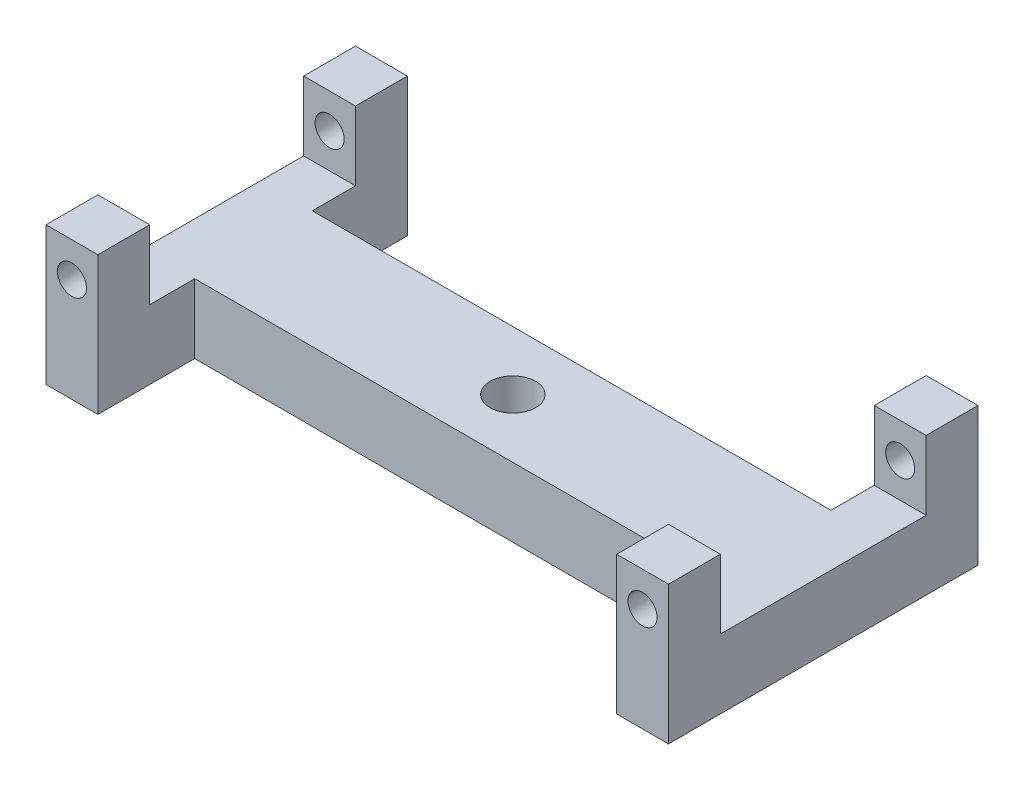
ISO-10303-21;
HEADER;
FILE_DESCRIPTION(('STEP AP214'),'2;1');
FILE_NAME('part.step','',(''),(''),'','','');
FILE_SCHEMA(('AUTOMOTIVE_DESIGN { 1 0 10303 214 1 1 1 1 }'));
ENDSEC;
DATA;
#1=APPLICATION_CONTEXT('core data for automotive mechanical design processes');
#2=APPLICATION_PROTOCOL_DEFINITION('international standard','automotive_design',2000,#1);
#3=PRODUCT_CONTEXT('',#1,'mechanical');
#4=PRODUCT('Part','Part','',(#3));
#5=PRODUCT_RELATED_PRODUCT_CATEGORY('part','',(#4));
#6=PRODUCT_DEFINITION_FORMATION('','',#4);
#7=PRODUCT_DEFINITION_CONTEXT('part definition',#1,'design');
#8=PRODUCT_DEFINITION('design','',#6,#7);
#9=PRODUCT_DEFINITION_SHAPE('','',#8);
#10=(LENGTH_UNIT() NAMED_UNIT(*) SI_UNIT(.MILLI.,.METRE.));
#11=(NAMED_UNIT(*) PLANE_ANGLE_UNIT() SI_UNIT($,.RADIAN.));
#12=(NAMED_UNIT(*) SI_UNIT($,.STERADIAN.) SOLID_ANGLE_UNIT());
#13=UNCERTAINTY_MEASURE_WITH_UNIT(LENGTH_MEASURE(1.E-05),#10,'distance_accuracy_value','');
#14=(GEOMETRIC_REPRESENTATION_CONTEXT(3) GLOBAL_UNCERTAINTY_ASSIGNED_CONTEXT((#13)) GLOBAL_UNIT_ASSIGNED_CONTEXT((#10,
#11,#12)) REPRESENTATION_CONTEXT('',''));
#15=CARTESIAN_POINT('',(0.,0.,0.));
#16=DIRECTION('',(0.,0.,1.));
#17=DIRECTION('',(1.,0.,0.));
#18=AXIS2_PLACEMENT_3D('',#15,#16,#17);
#19=CARTESIAN_POINT('',(0.,6.35,0.));
#20=DIRECTION('',(0.,-1.,0.));
#21=DIRECTION('',(0.,0.,-1.));
#22=AXIS2_PLACEMENT_3D('',#19,#20,#21);
#23=CYLINDRICAL_SURFACE('',#22,4.191);
#24=CARTESIAN_POINT('',(0.,6.35,0.));
#25=DIRECTION('',(0.,1.,0.));
#26=DIRECTION('',(0.,0.,1.));
#27=AXIS2_PLACEMENT_3D('',#24,#25,#26);
#28=CIRCLE('',#27,4.191);
#29=CARTESIAN_POINT('',(0.,6.35,4.191));
#30=VERTEX_POINT('',#29);
#31=EDGE_CURVE('E362',#30,#30,#28,.T.);
#32=ORIENTED_EDGE('',*,*,#31,.T.);
#33=EDGE_LOOP('',(#32));
#34=FACE_BOUND('',#33,.T.);
#35=CARTESIAN_POINT('',(0.,0.38125,0.));
#36=DIRECTION('',(0.,-1.,0.));
#37=DIRECTION('',(0.,0.,-1.));
#38=AXIS2_PLACEMENT_3D('',#35,#36,#37);
#39=CIRCLE('',#38,4.191);
#40=CARTESIAN_POINT('',(0.,0.38125,-4.191));
#41=VERTEX_POINT('',#40);
#42=EDGE_CURVE('E48',#41,#41,#39,.T.);
#43=ORIENTED_EDGE('',*,*,#42,.T.);
#44=EDGE_LOOP('',(#43));
#45=FACE_BOUND('',#44,.T.);
#46=ADVANCED_FACE('F44',(#34,#45),#23,.F.);
#47=CARTESIAN_POINT('',(0.,6.35,0.));
#48=DIRECTION('',(0.,1.,0.));
#49=DIRECTION('',(0.,0.,1.));
#50=AXIS2_PLACEMENT_3D('',#47,#48,#49);
#51=PLANE('',#50);
#52=ORIENTED_EDGE('',*,*,#31,.F.);
#53=EDGE_LOOP('',(#52));
#54=FACE_BOUND('',#53,.T.);
#55=DIRECTION('',(0.,0.,-1.));
#56=VECTOR('',#55,1.);
#57=CARTESIAN_POINT('',(47.625,6.35,28.575));
#58=LINE('',#57,#56);
#59=CARTESIAN_POINT('',(47.625,6.35,19.05));
#60=VERTEX_POINT('',#59);
#61=CARTESIAN_POINT('',(47.625,6.35,10.795));
#62=VERTEX_POINT('',#61);
#63=EDGE_CURVE('E338',#60,#62,#58,.T.);
#64=ORIENTED_EDGE('',*,*,#63,.F.);
#65=DIRECTION('',(-1.,0.,0.));
#66=VECTOR('',#65,1.);
#67=CARTESIAN_POINT('',(57.15,6.35,19.05));
#68=LINE('',#67,#66);
#69=CARTESIAN_POINT('',(57.15,6.35,19.05));
#70=VERTEX_POINT('',#69);
#71=EDGE_CURVE('E265',#70,#60,#68,.T.);
#72=ORIENTED_EDGE('',*,*,#71,.F.);
#73=DIRECTION('',(0.,0.,-1.));
#74=VECTOR('',#73,1.);
#75=CARTESIAN_POINT('',(57.15,6.35,-10.795));
#76=LINE('',#75,#74);
#77=CARTESIAN_POINT('',(57.15,6.35,-18.7325));
#78=VERTEX_POINT('',#77);
#79=EDGE_CURVE('E365',#70,#78,#76,.T.);
#80=ORIENTED_EDGE('',*,*,#79,.T.);
#81=DIRECTION('',(1.,0.,0.));
#82=VECTOR('',#81,1.);
#83=CARTESIAN_POINT('',(47.625,6.35,-18.7325));
#84=LINE('',#83,#82);
#85=CARTESIAN_POINT('',(47.625,6.35,-18.7325));
#86=VERTEX_POINT('',#85);
#87=EDGE_CURVE('E283',#86,#78,#84,.T.);
#88=ORIENTED_EDGE('',*,*,#87,.F.);
#89=DIRECTION('',(0.,0.,1.));
#90=VECTOR('',#89,1.);
#91=CARTESIAN_POINT('',(47.625,6.35,-28.2575));
#92=LINE('',#91,#90);
#93=CARTESIAN_POINT('',(47.625,6.35,-10.795));
#94=VERTEX_POINT('',#93);
#95=EDGE_CURVE('E68',#86,#94,#92,.T.);
#96=ORIENTED_EDGE('',*,*,#95,.T.);
#97=DIRECTION('',(-1.,0.,0.));
#98=VECTOR('',#97,1.);
#99=CARTESIAN_POINT('',(-57.15,6.35,-10.795));
#100=LINE('',#99,#98);
#101=CARTESIAN_POINT('',(-47.625,6.35,-10.795));
#102=VERTEX_POINT('',#101);
#103=EDGE_CURVE('E367',#94,#102,#100,.T.);
#104=ORIENTED_EDGE('',*,*,#103,.T.);
#105=DIRECTION('',(0.,0.,1.));
#106=VECTOR('',#105,1.);
#107=CARTESIAN_POINT('',(-47.625,6.35,-28.2575));
#108=LINE('',#107,#106);
#109=CARTESIAN_POINT('',(-47.625,6.35,-18.7325));
#110=VERTEX_POINT('',#109);
#111=EDGE_CURVE('E355',#110,#102,#108,.T.);
#112=ORIENTED_EDGE('',*,*,#111,.F.);
#113=DIRECTION('',(1.,0.,0.));
#114=VECTOR('',#113,1.);
#115=CARTESIAN_POINT('',(-57.15,6.35,-18.7325));
#116=LINE('',#115,#114);
#117=CARTESIAN_POINT('',(-57.15,6.35,-18.7325));
#118=VERTEX_POINT('',#117);
#119=EDGE_CURVE('E61',#118,#110,#116,.T.);
#120=ORIENTED_EDGE('',*,*,#119,.F.);
#121=DIRECTION('',(0.,0.,1.));
#122=VECTOR('',#121,1.);
#123=CARTESIAN_POINT('',(-57.15,6.35,-10.795));
#124=LINE('',#123,#122);
#125=CARTESIAN_POINT('',(-57.15,6.35,19.05));
#126=VERTEX_POINT('',#125);
#127=EDGE_CURVE('E53',#118,#126,#124,.T.);
#128=ORIENTED_EDGE('',*,*,#127,.T.);
#129=DIRECTION('',(-1.,0.,0.));
#130=VECTOR('',#129,1.);
#131=CARTESIAN_POINT('',(-57.15,6.35,19.05));
#132=LINE('',#131,#130);
#133=CARTESIAN_POINT('',(-47.625,6.35,19.05));
#134=VERTEX_POINT('',#133);
#135=EDGE_CURVE('E299',#134,#126,#132,.T.);
#136=ORIENTED_EDGE('',*,*,#135,.F.);
#137=DIRECTION('',(0.,0.,-1.));
#138=VECTOR('',#137,1.);
#139=CARTESIAN_POINT('',(-47.625,6.35,28.575));
#140=LINE('',#139,#138);
#141=CARTESIAN_POINT('',(-47.625,6.35,10.795));
#142=VERTEX_POINT('',#141);
#143=EDGE_CURVE('E346',#134,#142,#140,.T.);
#144=ORIENTED_EDGE('',*,*,#143,.T.);
#145=DIRECTION('',(1.,0.,0.));
#146=VECTOR('',#145,1.);
#147=CARTESIAN_POINT('',(-57.15,6.35,10.795));
#148=LINE('',#147,#146);
#149=EDGE_CURVE('E12',#142,#62,#148,.T.);
#150=ORIENTED_EDGE('',*,*,#149,.T.);
#151=EDGE_LOOP('',(#64,#72,#80,#88,#96,#104,#112,#120,#128,#136,#144,#150));
#152=FACE_BOUND('',#151,.T.);
#153=ADVANCED_FACE('F392',(#54,#152),#51,.T.);
#154=CARTESIAN_POINT('',(-57.15,6.35,10.795));
#155=DIRECTION('',(0.,0.,-1.));
#156=DIRECTION('',(-1.,0.,0.));
#157=AXIS2_PLACEMENT_3D('',#154,#155,#156);
#158=PLANE('',#157);
#159=DIRECTION('',(0.,-1.,0.));
#160=VECTOR('',#159,1.);
#161=CARTESIAN_POINT('',(47.625,6.35,10.795));
#162=LINE('',#161,#160);
#163=CARTESIAN_POINT('',(47.625,-6.35,10.795));
#164=VERTEX_POINT('',#163);
#165=EDGE_CURVE('E334',#62,#164,#162,.T.);
#166=ORIENTED_EDGE('',*,*,#165,.F.);
#167=ORIENTED_EDGE('',*,*,#149,.F.);
#168=DIRECTION('',(0.,1.,0.));
#169=VECTOR('',#168,1.);
#170=CARTESIAN_POINT('',(-47.625,6.35,10.795));
#171=LINE('',#170,#169);
#172=CARTESIAN_POINT('',(-47.625,-6.35,10.795));
#173=VERTEX_POINT('',#172);
#174=EDGE_CURVE('E341',#173,#142,#171,.T.);
#175=ORIENTED_EDGE('',*,*,#174,.F.);
#176=DIRECTION('',(-1.,0.,0.));
#177=VECTOR('',#176,1.);
#178=CARTESIAN_POINT('',(47.625,-6.35,10.795));
#179=LINE('',#178,#177);
#180=EDGE_CURVE('E223',#164,#173,#179,.T.);
#181=ORIENTED_EDGE('',*,*,#180,.F.);
#182=EDGE_LOOP('',(#166,#167,#175,#181));
#183=FACE_BOUND('',#182,.T.);
#184=ADVANCED_FACE('F395',(#183),#158,.F.);
#185=CARTESIAN_POINT('',(-57.15,6.35,-10.795));
#186=DIRECTION('',(0.,0.,1.));
#187=DIRECTION('',(1.,0.,0.));
#188=AXIS2_PLACEMENT_3D('',#185,#186,#187);
#189=PLANE('',#188);
#190=DIRECTION('',(0.,-1.,0.));
#191=VECTOR('',#190,1.);
#192=CARTESIAN_POINT('',(-47.625,6.35,-10.795));
#193=LINE('',#192,#191);
#194=CARTESIAN_POINT('',(-47.625,-6.35,-10.795));
#195=VERTEX_POINT('',#194);
#196=EDGE_CURVE('E349',#102,#195,#193,.T.);
#197=ORIENTED_EDGE('',*,*,#196,.F.);
#198=ORIENTED_EDGE('',*,*,#103,.F.);
#199=DIRECTION('',(0.,1.,0.));
#200=VECTOR('',#199,1.);
#201=CARTESIAN_POINT('',(47.625,6.35,-10.795));
#202=LINE('',#201,#200);
#203=CARTESIAN_POINT('',(47.625,-6.35,-10.795));
#204=VERTEX_POINT('',#203);
#205=EDGE_CURVE('E196',#204,#94,#202,.T.);
#206=ORIENTED_EDGE('',*,*,#205,.F.);
#207=DIRECTION('',(1.,0.,0.));
#208=VECTOR('',#207,1.);
#209=CARTESIAN_POINT('',(-47.625,-6.35,-10.795));
#210=LINE('',#209,#208);
#211=EDGE_CURVE('E241',#195,#204,#210,.T.);
#212=ORIENTED_EDGE('',*,*,#211,.F.);
#213=EDGE_LOOP('',(#197,#198,#206,#212));
#214=FACE_BOUND('',#213,.T.);
#215=ADVANCED_FACE('F402',(#214),#189,.F.);
#216=CARTESIAN_POINT('',(57.15,6.35,-10.795));
#217=DIRECTION('',(-1.,0.,0.));
#218=DIRECTION('',(0.,0.,1.));
#219=AXIS2_PLACEMENT_3D('',#216,#217,#218);
#220=PLANE('',#219);
#221=DIRECTION('',(0.,1.,0.));
#222=VECTOR('',#221,1.);
#223=CARTESIAN_POINT('',(57.15,6.35,28.575));
#224=LINE('',#223,#222);
#225=CARTESIAN_POINT('',(57.15,-6.35,28.575));
#226=VERTEX_POINT('',#225);
#227=CARTESIAN_POINT('',(57.15,19.05,28.575));
#228=VERTEX_POINT('',#227);
#229=EDGE_CURVE('E201',#226,#228,#224,.T.);
#230=ORIENTED_EDGE('',*,*,#229,.F.);
#231=DIRECTION('',(0.,0.,1.));
#232=VECTOR('',#231,1.);
#233=CARTESIAN_POINT('',(57.15,-6.35,-28.2575));
#234=LINE('',#233,#232);
#235=CARTESIAN_POINT('',(57.15,-6.35,-28.2575));
#236=VERTEX_POINT('',#235);
#237=EDGE_CURVE('E199',#236,#226,#234,.T.);
#238=ORIENTED_EDGE('',*,*,#237,.F.);
#239=DIRECTION('',(0.,-1.,0.));
#240=VECTOR('',#239,1.);
#241=CARTESIAN_POINT('',(57.15,6.35,-28.2575));
#242=LINE('',#241,#240);
#243=CARTESIAN_POINT('',(57.15,19.05,-28.2575));
#244=VERTEX_POINT('',#243);
#245=EDGE_CURVE('E185',#244,#236,#242,.T.);
#246=ORIENTED_EDGE('',*,*,#245,.F.);
#247=DIRECTION('',(0.,0.,-1.));
#248=VECTOR('',#247,1.);
#249=CARTESIAN_POINT('',(57.15,19.05,-28.2575));
#250=LINE('',#249,#248);
#251=CARTESIAN_POINT('',(57.15,19.05,-18.7325));
#252=VERTEX_POINT('',#251);
#253=EDGE_CURVE('E289',#252,#244,#250,.T.);
#254=ORIENTED_EDGE('',*,*,#253,.F.);
#255=DIRECTION('',(0.,-1.,0.));
#256=VECTOR('',#255,1.);
#257=CARTESIAN_POINT('',(57.15,19.05,-18.7325));
#258=LINE('',#257,#256);
#259=EDGE_CURVE('E292',#252,#78,#258,.T.);
#260=ORIENTED_EDGE('',*,*,#259,.T.);
#261=ORIENTED_EDGE('',*,*,#79,.F.);
#262=DIRECTION('',(0.,-1.,0.));
#263=VECTOR('',#262,1.);
#264=CARTESIAN_POINT('',(57.15,19.05,19.05));
#265=LINE('',#264,#263);
#266=CARTESIAN_POINT('',(57.15,19.05,19.05));
#267=VERTEX_POINT('',#266);
#268=EDGE_CURVE('E281',#267,#70,#265,.T.);
#269=ORIENTED_EDGE('',*,*,#268,.F.);
#270=DIRECTION('',(0.,0.,-1.));
#271=VECTOR('',#270,1.);
#272=CARTESIAN_POINT('',(57.15,19.05,28.575));
#273=LINE('',#272,#271);
#274=EDGE_CURVE('E266',#228,#267,#273,.T.);
#275=ORIENTED_EDGE('',*,*,#274,.F.);
#276=EDGE_LOOP('',(#230,#238,#246,#254,#260,#261,#269,#275));
#277=FACE_BOUND('',#276,.T.);
#278=ADVANCED_FACE('F46',(#277),#220,.F.);
#279=CARTESIAN_POINT('',(-57.15,6.35,-10.795));
#280=DIRECTION('',(1.,0.,0.));
#281=DIRECTION('',(0.,0.,-1.));
#282=AXIS2_PLACEMENT_3D('',#279,#280,#281);
#283=PLANE('',#282);
#284=DIRECTION('',(0.,1.,0.));
#285=VECTOR('',#284,1.);
#286=CARTESIAN_POINT('',(-57.15,6.35,-28.2575));
#287=LINE('',#286,#285);
#288=CARTESIAN_POINT('',(-57.15,-6.35,-28.2575));
#289=VERTEX_POINT('',#288);
#290=CARTESIAN_POINT('',(-57.15,19.05,-28.2575));
#291=VERTEX_POINT('',#290);
#292=EDGE_CURVE('E350',#289,#291,#287,.T.);
#293=ORIENTED_EDGE('',*,*,#292,.F.);
#294=DIRECTION('',(0.,0.,-1.));
#295=VECTOR('',#294,1.);
#296=CARTESIAN_POINT('',(-57.15,-6.35,28.575));
#297=LINE('',#296,#295);
#298=CARTESIAN_POINT('',(-57.15,-6.35,28.575));
#299=VERTEX_POINT('',#298);
#300=EDGE_CURVE('E232',#299,#289,#297,.T.);
#301=ORIENTED_EDGE('',*,*,#300,.F.);
#302=DIRECTION('',(0.,-1.,0.));
#303=VECTOR('',#302,1.);
#304=CARTESIAN_POINT('',(-57.15,6.35,28.575));
#305=LINE('',#304,#303);
#306=CARTESIAN_POINT('',(-57.15,19.05,28.575));
#307=VERTEX_POINT('',#306);
#308=EDGE_CURVE('E342',#307,#299,#305,.T.);
#309=ORIENTED_EDGE('',*,*,#308,.F.);
#310=DIRECTION('',(0.,0.,1.));
#311=VECTOR('',#310,1.);
#312=CARTESIAN_POINT('',(-57.15,19.05,28.575));
#313=LINE('',#312,#311);
#314=CARTESIAN_POINT('',(-57.15,19.05,19.05));
#315=VERTEX_POINT('',#314);
#316=EDGE_CURVE('E300',#315,#307,#313,.T.);
#317=ORIENTED_EDGE('',*,*,#316,.F.);
#318=DIRECTION('',(0.,-1.,0.));
#319=VECTOR('',#318,1.);
#320=CARTESIAN_POINT('',(-57.15,19.05,19.05));
#321=LINE('',#320,#319);
#322=EDGE_CURVE('E310',#315,#126,#321,.T.);
#323=ORIENTED_EDGE('',*,*,#322,.T.);
#324=ORIENTED_EDGE('',*,*,#127,.F.);
#325=DIRECTION('',(0.,-1.,0.));
#326=VECTOR('',#325,1.);
#327=CARTESIAN_POINT('',(-57.15,19.05,-18.7325));
#328=LINE('',#327,#326);
#329=CARTESIAN_POINT('',(-57.15,19.05,-18.7325));
#330=VERTEX_POINT('',#329);
#331=EDGE_CURVE('E331',#330,#118,#328,.T.);
#332=ORIENTED_EDGE('',*,*,#331,.F.);
#333=DIRECTION('',(0.,0.,1.));
#334=VECTOR('',#333,1.);
#335=CARTESIAN_POINT('',(-57.15,19.05,-28.2575));
#336=LINE('',#335,#334);
#337=EDGE_CURVE('E316',#291,#330,#336,.T.);
#338=ORIENTED_EDGE('',*,*,#337,.F.);
#339=EDGE_LOOP('',(#293,#301,#309,#317,#323,#324,#332,#338));
#340=FACE_BOUND('',#339,.T.);
#341=ADVANCED_FACE('F389',(#340),#283,.F.);
#342=CARTESIAN_POINT('',(47.625,6.35,-28.2575));
#343=DIRECTION('',(1.,0.,0.));
#344=DIRECTION('',(0.,1.,0.));
#345=AXIS2_PLACEMENT_3D('',#342,#343,#344);
#346=PLANE('',#345);
#347=ORIENTED_EDGE('',*,*,#205,.T.);
#348=ORIENTED_EDGE('',*,*,#95,.F.);
#349=DIRECTION('',(0.,-1.,0.));
#350=VECTOR('',#349,1.);
#351=CARTESIAN_POINT('',(47.625,19.05,-18.7325));
#352=LINE('',#351,#350);
#353=CARTESIAN_POINT('',(47.625,19.05,-18.7325));
#354=VERTEX_POINT('',#353);
#355=EDGE_CURVE('E297',#354,#86,#352,.T.);
#356=ORIENTED_EDGE('',*,*,#355,.F.);
#357=DIRECTION('',(0.,0.,1.));
#358=VECTOR('',#357,1.);
#359=CARTESIAN_POINT('',(47.625,19.05,-28.2575));
#360=LINE('',#359,#358);
#361=CARTESIAN_POINT('',(47.625,19.05,-28.2575));
#362=VERTEX_POINT('',#361);
#363=EDGE_CURVE('E284',#362,#354,#360,.T.);
#364=ORIENTED_EDGE('',*,*,#363,.F.);
#365=DIRECTION('',(0.,1.,0.));
#366=VECTOR('',#365,1.);
#367=CARTESIAN_POINT('',(47.625,6.35,-28.2575));
#368=LINE('',#367,#366);
#369=CARTESIAN_POINT('',(47.625,-6.35,-28.2575));
#370=VERTEX_POINT('',#369);
#371=EDGE_CURVE('E195',#370,#362,#368,.T.);
#372=ORIENTED_EDGE('',*,*,#371,.F.);
#373=DIRECTION('',(0.,0.,-1.));
#374=VECTOR('',#373,1.);
#375=CARTESIAN_POINT('',(47.625,-6.35,-10.795));
#376=LINE('',#375,#374);
#377=EDGE_CURVE('E211',#204,#370,#376,.T.);
#378=ORIENTED_EDGE('',*,*,#377,.F.);
#379=EDGE_LOOP('',(#347,#348,#356,#364,#372,#378));
#380=FACE_BOUND('',#379,.T.);
#381=ADVANCED_FACE('F411',(#380),#346,.F.);
#382=CARTESIAN_POINT('',(0.,0.,-28.2575));
#383=DIRECTION('',(0.,0.,-1.));
#384=DIRECTION('',(-1.,0.,0.));
#385=AXIS2_PLACEMENT_3D('',#382,#383,#384);
#386=PLANE('',#385);
#387=CARTESIAN_POINT('',(52.3875,12.7,-28.2575));
#388=DIRECTION('',(0.,0.,-1.));
#389=DIRECTION('',(-1.,0.,0.));
#390=AXIS2_PLACEMENT_3D('',#387,#388,#389);
#391=CIRCLE('',#390,2.667);
#392=CARTESIAN_POINT('',(49.7205,12.7,-28.2575));
#393=VERTEX_POINT('',#392);
#394=EDGE_CURVE('E251',#393,#393,#391,.F.);
#395=ORIENTED_EDGE('',*,*,#394,.T.);
#396=EDGE_LOOP('',(#395));
#397=FACE_BOUND('',#396,.T.);
#398=ORIENTED_EDGE('',*,*,#245,.T.);
#399=DIRECTION('',(1.,0.,0.));
#400=VECTOR('',#399,1.);
#401=CARTESIAN_POINT('',(47.625,-6.35,-28.2575));
#402=LINE('',#401,#400);
#403=EDGE_CURVE('E189',#370,#236,#402,.T.);
#404=ORIENTED_EDGE('',*,*,#403,.F.);
#405=ORIENTED_EDGE('',*,*,#371,.T.);
#406=DIRECTION('',(-1.,0.,0.));
#407=VECTOR('',#406,1.);
#408=CARTESIAN_POINT('',(47.625,19.05,-28.2575));
#409=LINE('',#408,#407);
#410=EDGE_CURVE('E191',#244,#362,#409,.T.);
#411=ORIENTED_EDGE('',*,*,#410,.F.);
#412=EDGE_LOOP('',(#398,#404,#405,#411));
#413=FACE_BOUND('',#412,.T.);
#414=ADVANCED_FACE('F187',(#397,#413),#386,.T.);
#415=CARTESIAN_POINT('',(-47.625,6.35,-28.2575));
#416=DIRECTION('',(-1.,0.,0.));
#417=DIRECTION('',(0.,-1.,0.));
#418=AXIS2_PLACEMENT_3D('',#415,#416,#417);
#419=PLANE('',#418);
#420=ORIENTED_EDGE('',*,*,#196,.T.);
#421=DIRECTION('',(0.,0.,1.));
#422=VECTOR('',#421,1.);
#423=CARTESIAN_POINT('',(-47.625,-6.35,-28.2575));
#424=LINE('',#423,#422);
#425=CARTESIAN_POINT('',(-47.625,-6.35,-28.2575));
#426=VERTEX_POINT('',#425);
#427=EDGE_CURVE('E238',#426,#195,#424,.T.);
#428=ORIENTED_EDGE('',*,*,#427,.F.);
#429=DIRECTION('',(0.,-1.,0.));
#430=VECTOR('',#429,1.);
#431=CARTESIAN_POINT('',(-47.625,6.35,-28.2575));
#432=LINE('',#431,#430);
#433=CARTESIAN_POINT('',(-47.625,19.05,-28.2575));
#434=VERTEX_POINT('',#433);
#435=EDGE_CURVE('E353',#434,#426,#432,.T.);
#436=ORIENTED_EDGE('',*,*,#435,.F.);
#437=DIRECTION('',(0.,0.,-1.));
#438=VECTOR('',#437,1.);
#439=CARTESIAN_POINT('',(-47.625,19.05,-28.2575));
#440=LINE('',#439,#438);
#441=CARTESIAN_POINT('',(-47.625,19.05,-18.7325));
#442=VERTEX_POINT('',#441);
#443=EDGE_CURVE('E321',#442,#434,#440,.T.);
#444=ORIENTED_EDGE('',*,*,#443,.F.);
#445=DIRECTION('',(0.,-1.,0.));
#446=VECTOR('',#445,1.);
#447=CARTESIAN_POINT('',(-47.625,19.05,-18.7325));
#448=LINE('',#447,#446);
#449=EDGE_CURVE('E327',#442,#110,#448,.T.);
#450=ORIENTED_EDGE('',*,*,#449,.T.);
#451=ORIENTED_EDGE('',*,*,#111,.T.);
#452=EDGE_LOOP('',(#420,#428,#436,#444,#450,#451));
#453=FACE_BOUND('',#452,.T.);
#454=ADVANCED_FACE('F425',(#453),#419,.F.);
#455=CARTESIAN_POINT('',(0.,0.,-28.2575));
#456=DIRECTION('',(0.,0.,1.));
#457=DIRECTION('',(1.,0.,0.));
#458=AXIS2_PLACEMENT_3D('',#455,#456,#457);
#459=PLANE('',#458);
#460=CARTESIAN_POINT('',(-52.3875,12.7,-28.2575));
#461=DIRECTION('',(0.,0.,1.));
#462=DIRECTION('',(1.,0.,0.));
#463=AXIS2_PLACEMENT_3D('',#460,#461,#462);
#464=CIRCLE('',#463,2.667);
#465=CARTESIAN_POINT('',(-49.7205,12.7,-28.2575));
#466=VERTEX_POINT('',#465);
#467=EDGE_CURVE('E262',#466,#466,#464,.F.);
#468=ORIENTED_EDGE('',*,*,#467,.F.);
#469=EDGE_LOOP('',(#468));
#470=FACE_BOUND('',#469,.T.);
#471=ORIENTED_EDGE('',*,*,#292,.T.);
#472=DIRECTION('',(-1.,0.,0.));
#473=VECTOR('',#472,1.);
#474=CARTESIAN_POINT('',(-57.15,19.05,-28.2575));
#475=LINE('',#474,#473);
#476=EDGE_CURVE('E324',#434,#291,#475,.T.);
#477=ORIENTED_EDGE('',*,*,#476,.F.);
#478=ORIENTED_EDGE('',*,*,#435,.T.);
#479=DIRECTION('',(1.,0.,0.));
#480=VECTOR('',#479,1.);
#481=CARTESIAN_POINT('',(-57.15,-6.35,-28.2575));
#482=LINE('',#481,#480);
#483=EDGE_CURVE('E235',#289,#426,#482,.T.);
#484=ORIENTED_EDGE('',*,*,#483,.F.);
#485=EDGE_LOOP('',(#471,#477,#478,#484));
#486=FACE_BOUND('',#485,.T.);
#487=ADVANCED_FACE('F430',(#470,#486),#459,.F.);
#488=CARTESIAN_POINT('',(-47.625,6.35,28.575));
#489=DIRECTION('',(-1.,0.,0.));
#490=DIRECTION('',(0.,-1.,0.));
#491=AXIS2_PLACEMENT_3D('',#488,#489,#490);
#492=PLANE('',#491);
#493=ORIENTED_EDGE('',*,*,#174,.T.);
#494=ORIENTED_EDGE('',*,*,#143,.F.);
#495=DIRECTION('',(0.,-1.,0.));
#496=VECTOR('',#495,1.);
#497=CARTESIAN_POINT('',(-47.625,19.05,19.05));
#498=LINE('',#497,#496);
#499=CARTESIAN_POINT('',(-47.625,19.05,19.05));
#500=VERTEX_POINT('',#499);
#501=EDGE_CURVE('E314',#500,#134,#498,.T.);
#502=ORIENTED_EDGE('',*,*,#501,.F.);
#503=DIRECTION('',(0.,0.,-1.));
#504=VECTOR('',#503,1.);
#505=CARTESIAN_POINT('',(-47.625,19.05,28.575));
#506=LINE('',#505,#504);
#507=CARTESIAN_POINT('',(-47.625,19.05,28.575));
#508=VERTEX_POINT('',#507);
#509=EDGE_CURVE('E306',#508,#500,#506,.T.);
#510=ORIENTED_EDGE('',*,*,#509,.F.);
#511=DIRECTION('',(0.,1.,0.));
#512=VECTOR('',#511,1.);
#513=CARTESIAN_POINT('',(-47.625,6.35,28.575));
#514=LINE('',#513,#512);
#515=CARTESIAN_POINT('',(-47.625,-6.35,28.575));
#516=VERTEX_POINT('',#515);
#517=EDGE_CURVE('E344',#516,#508,#514,.T.);
#518=ORIENTED_EDGE('',*,*,#517,.F.);
#519=DIRECTION('',(0.,0.,1.));
#520=VECTOR('',#519,1.);
#521=CARTESIAN_POINT('',(-47.625,-6.35,10.795));
#522=LINE('',#521,#520);
#523=EDGE_CURVE('E226',#173,#516,#522,.T.);
#524=ORIENTED_EDGE('',*,*,#523,.F.);
#525=EDGE_LOOP('',(#493,#494,#502,#510,#518,#524));
#526=FACE_BOUND('',#525,.T.);
#527=ADVANCED_FACE('F441',(#526),#492,.F.);
#528=CARTESIAN_POINT('',(0.,0.,28.575));
#529=DIRECTION('',(0.,0.,1.));
#530=DIRECTION('',(1.,0.,0.));
#531=AXIS2_PLACEMENT_3D('',#528,#529,#530);
#532=PLANE('',#531);
#533=CARTESIAN_POINT('',(-52.3875,12.7,28.575));
#534=DIRECTION('',(0.,0.,1.));
#535=DIRECTION('',(1.,0.,0.));
#536=AXIS2_PLACEMENT_3D('',#533,#534,#535);
#537=CIRCLE('',#536,2.667);
#538=CARTESIAN_POINT('',(-49.7205,12.7,28.575));
#539=VERTEX_POINT('',#538);
#540=EDGE_CURVE('E259',#539,#539,#537,.F.);
#541=ORIENTED_EDGE('',*,*,#540,.T.);
#542=EDGE_LOOP('',(#541));
#543=FACE_BOUND('',#542,.T.);
#544=ORIENTED_EDGE('',*,*,#308,.T.);
#545=DIRECTION('',(-1.,0.,0.));
#546=VECTOR('',#545,1.);
#547=CARTESIAN_POINT('',(-47.625,-6.35,28.575));
#548=LINE('',#547,#546);
#549=EDGE_CURVE('E229',#516,#299,#548,.T.);
#550=ORIENTED_EDGE('',*,*,#549,.F.);
#551=ORIENTED_EDGE('',*,*,#517,.T.);
#552=DIRECTION('',(1.,0.,0.));
#553=VECTOR('',#552,1.);
#554=CARTESIAN_POINT('',(-57.15,19.05,28.575));
#555=LINE('',#554,#553);
#556=EDGE_CURVE('E303',#307,#508,#555,.T.);
#557=ORIENTED_EDGE('',*,*,#556,.F.);
#558=EDGE_LOOP('',(#544,#550,#551,#557));
#559=FACE_BOUND('',#558,.T.);
#560=ADVANCED_FACE('F436',(#543,#559),#532,.T.);
#561=CARTESIAN_POINT('',(47.625,6.35,28.575));
#562=DIRECTION('',(1.,0.,0.));
#563=DIRECTION('',(0.,1.,0.));
#564=AXIS2_PLACEMENT_3D('',#561,#562,#563);
#565=PLANE('',#564);
#566=ORIENTED_EDGE('',*,*,#165,.T.);
#567=DIRECTION('',(0.,0.,-1.));
#568=VECTOR('',#567,1.);
#569=CARTESIAN_POINT('',(47.625,-6.35,28.575));
#570=LINE('',#569,#568);
#571=CARTESIAN_POINT('',(47.625,-6.35,28.575));
#572=VERTEX_POINT('',#571);
#573=EDGE_CURVE('E220',#572,#164,#570,.T.);
#574=ORIENTED_EDGE('',*,*,#573,.F.);
#575=DIRECTION('',(0.,-1.,0.));
#576=VECTOR('',#575,1.);
#577=CARTESIAN_POINT('',(47.625,6.35,28.575));
#578=LINE('',#577,#576);
#579=CARTESIAN_POINT('',(47.625,19.05,28.575));
#580=VERTEX_POINT('',#579);
#581=EDGE_CURVE('E336',#580,#572,#578,.T.);
#582=ORIENTED_EDGE('',*,*,#581,.F.);
#583=DIRECTION('',(0.,0.,1.));
#584=VECTOR('',#583,1.);
#585=CARTESIAN_POINT('',(47.625,19.05,28.575));
#586=LINE('',#585,#584);
#587=CARTESIAN_POINT('',(47.625,19.05,19.05));
#588=VERTEX_POINT('',#587);
#589=EDGE_CURVE('E271',#588,#580,#586,.T.);
#590=ORIENTED_EDGE('',*,*,#589,.F.);
#591=DIRECTION('',(0.,-1.,0.));
#592=VECTOR('',#591,1.);
#593=CARTESIAN_POINT('',(47.625,19.05,19.05));
#594=LINE('',#593,#592);
#595=EDGE_CURVE('E277',#588,#60,#594,.T.);
#596=ORIENTED_EDGE('',*,*,#595,.T.);
#597=ORIENTED_EDGE('',*,*,#63,.T.);
#598=EDGE_LOOP('',(#566,#574,#582,#590,#596,#597));
#599=FACE_BOUND('',#598,.T.);
#600=ADVANCED_FACE('F447',(#599),#565,.F.);
#601=CARTESIAN_POINT('',(0.,0.,28.575));
#602=DIRECTION('',(0.,0.,-1.));
#603=DIRECTION('',(-1.,0.,0.));
#604=AXIS2_PLACEMENT_3D('',#601,#602,#603);
#605=PLANE('',#604);
#606=CARTESIAN_POINT('',(52.3875,12.7,28.575));
#607=DIRECTION('',(0.,0.,-1.));
#608=DIRECTION('',(-1.,0.,0.));
#609=AXIS2_PLACEMENT_3D('',#606,#607,#608);
#610=CIRCLE('',#609,2.667);
#611=CARTESIAN_POINT('',(49.7205,12.7,28.575));
#612=VERTEX_POINT('',#611);
#613=EDGE_CURVE('E248',#612,#612,#610,.F.);
#614=ORIENTED_EDGE('',*,*,#613,.F.);
#615=EDGE_LOOP('',(#614));
#616=FACE_BOUND('',#615,.T.);
#617=ORIENTED_EDGE('',*,*,#229,.T.);
#618=DIRECTION('',(1.,0.,0.));
#619=VECTOR('',#618,1.);
#620=CARTESIAN_POINT('',(57.15,19.05,28.575));
#621=LINE('',#620,#619);
#622=EDGE_CURVE('E274',#580,#228,#621,.T.);
#623=ORIENTED_EDGE('',*,*,#622,.F.);
#624=ORIENTED_EDGE('',*,*,#581,.T.);
#625=DIRECTION('',(-1.,0.,0.));
#626=VECTOR('',#625,1.);
#627=CARTESIAN_POINT('',(57.15,-6.35,28.575));
#628=LINE('',#627,#626);
#629=EDGE_CURVE('E205',#226,#572,#628,.T.);
#630=ORIENTED_EDGE('',*,*,#629,.F.);
#631=EDGE_LOOP('',(#617,#623,#624,#630));
#632=FACE_BOUND('',#631,.T.);
#633=ADVANCED_FACE('F449',(#616,#632),#605,.F.);
#634=CARTESIAN_POINT('',(-57.15,19.05,-18.7325));
#635=DIRECTION('',(0.,0.,-1.));
#636=DIRECTION('',(-1.,0.,0.));
#637=AXIS2_PLACEMENT_3D('',#634,#635,#636);
#638=PLANE('',#637);
#639=CARTESIAN_POINT('',(-52.3875,12.7,-18.7325));
#640=DIRECTION('',(0.,0.,-1.));
#641=DIRECTION('',(-1.,0.,0.));
#642=AXIS2_PLACEMENT_3D('',#639,#640,#641);
#643=CIRCLE('',#642,2.667);
#644=CARTESIAN_POINT('',(-55.0545,12.7,-18.7325));
#645=VERTEX_POINT('',#644);
#646=EDGE_CURVE('E255',#645,#645,#643,.F.);
#647=ORIENTED_EDGE('',*,*,#646,.F.);
#648=EDGE_LOOP('',(#647));
#649=FACE_BOUND('',#648,.T.);
#650=ORIENTED_EDGE('',*,*,#119,.T.);
#651=ORIENTED_EDGE('',*,*,#449,.F.);
#652=DIRECTION('',(1.,0.,0.));
#653=VECTOR('',#652,1.);
#654=CARTESIAN_POINT('',(-57.15,19.05,-18.7325));
#655=LINE('',#654,#653);
#656=EDGE_CURVE('E319',#330,#442,#655,.T.);
#657=ORIENTED_EDGE('',*,*,#656,.F.);
#658=ORIENTED_EDGE('',*,*,#331,.T.);
#659=EDGE_LOOP('',(#650,#651,#657,#658));
#660=FACE_BOUND('',#659,.T.);
#661=ADVANCED_FACE('F423',(#649,#660),#638,.F.);
#662=CARTESIAN_POINT('',(0.,19.05,0.));
#663=DIRECTION('',(0.,1.,0.));
#664=DIRECTION('',(0.,0.,1.));
#665=AXIS2_PLACEMENT_3D('',#662,#663,#664);
#666=PLANE('',#665);
#667=ORIENTED_EDGE('',*,*,#337,.T.);
#668=ORIENTED_EDGE('',*,*,#656,.T.);
#669=ORIENTED_EDGE('',*,*,#443,.T.);
#670=ORIENTED_EDGE('',*,*,#476,.T.);
#671=EDGE_LOOP('',(#667,#668,#669,#670));
#672=FACE_BOUND('',#671,.T.);
#673=ADVANCED_FACE('F380',(#672),#666,.T.);
#674=CARTESIAN_POINT('',(-57.15,19.05,19.05));
#675=DIRECTION('',(0.,0.,1.));
#676=DIRECTION('',(1.,0.,0.));
#677=AXIS2_PLACEMENT_3D('',#674,#675,#676);
#678=PLANE('',#677);
#679=CARTESIAN_POINT('',(-52.3875,12.7,19.05));
#680=DIRECTION('',(0.,0.,1.));
#681=DIRECTION('',(1.,0.,0.));
#682=AXIS2_PLACEMENT_3D('',#679,#680,#681);
#683=CIRCLE('',#682,2.667);
#684=CARTESIAN_POINT('',(-49.7205,12.7,19.05));
#685=VERTEX_POINT('',#684);
#686=EDGE_CURVE('E254',#685,#685,#683,.F.);
#687=ORIENTED_EDGE('',*,*,#686,.F.);
#688=EDGE_LOOP('',(#687));
#689=FACE_BOUND('',#688,.T.);
#690=ORIENTED_EDGE('',*,*,#135,.T.);
#691=ORIENTED_EDGE('',*,*,#322,.F.);
#692=DIRECTION('',(-1.,0.,0.));
#693=VECTOR('',#692,1.);
#694=CARTESIAN_POINT('',(-57.15,19.05,19.05));
#695=LINE('',#694,#693);
#696=EDGE_CURVE('E308',#500,#315,#695,.T.);
#697=ORIENTED_EDGE('',*,*,#696,.F.);
#698=ORIENTED_EDGE('',*,*,#501,.T.);
#699=EDGE_LOOP('',(#690,#691,#697,#698));
#700=FACE_BOUND('',#699,.T.);
#701=ADVANCED_FACE('F376',(#689,#700),#678,.F.);
#702=CARTESIAN_POINT('',(0.,19.05,0.));
#703=DIRECTION('',(0.,-1.,0.));
#704=DIRECTION('',(0.,0.,-1.));
#705=AXIS2_PLACEMENT_3D('',#702,#703,#704);
#706=PLANE('',#705);
#707=ORIENTED_EDGE('',*,*,#316,.T.);
#708=ORIENTED_EDGE('',*,*,#556,.T.);
#709=ORIENTED_EDGE('',*,*,#509,.T.);
#710=ORIENTED_EDGE('',*,*,#696,.T.);
#711=EDGE_LOOP('',(#707,#708,#709,#710));
#712=FACE_BOUND('',#711,.T.);
#713=ADVANCED_FACE('F379',(#712),#706,.F.);
#714=CARTESIAN_POINT('',(47.625,19.05,-18.7325));
#715=DIRECTION('',(0.,0.,-1.));
#716=DIRECTION('',(-1.,0.,0.));
#717=AXIS2_PLACEMENT_3D('',#714,#715,#716);
#718=PLANE('',#717);
#719=CARTESIAN_POINT('',(52.3875,12.7,-18.7325));
#720=DIRECTION('',(0.,0.,-1.));
#721=DIRECTION('',(-1.,0.,0.));
#722=AXIS2_PLACEMENT_3D('',#719,#720,#721);
#723=CIRCLE('',#722,2.667);
#724=CARTESIAN_POINT('',(49.7205,12.7,-18.7325));
#725=VERTEX_POINT('',#724);
#726=EDGE_CURVE('E245',#725,#725,#723,.F.);
#727=ORIENTED_EDGE('',*,*,#726,.F.);
#728=EDGE_LOOP('',(#727));
#729=FACE_BOUND('',#728,.T.);
#730=ORIENTED_EDGE('',*,*,#87,.T.);
#731=ORIENTED_EDGE('',*,*,#259,.F.);
#732=DIRECTION('',(1.,0.,0.));
#733=VECTOR('',#732,1.);
#734=CARTESIAN_POINT('',(47.625,19.05,-18.7325));
#735=LINE('',#734,#733);
#736=EDGE_CURVE('E287',#354,#252,#735,.T.);
#737=ORIENTED_EDGE('',*,*,#736,.F.);
#738=ORIENTED_EDGE('',*,*,#355,.T.);
#739=EDGE_LOOP('',(#730,#731,#737,#738));
#740=FACE_BOUND('',#739,.T.);
#741=ADVANCED_FACE('F461',(#729,#740),#718,.F.);
#742=CARTESIAN_POINT('',(0.,19.05,0.));
#743=DIRECTION('',(0.,1.,0.));
#744=DIRECTION('',(0.,0.,1.));
#745=AXIS2_PLACEMENT_3D('',#742,#743,#744);
#746=PLANE('',#745);
#747=ORIENTED_EDGE('',*,*,#363,.T.);
#748=ORIENTED_EDGE('',*,*,#736,.T.);
#749=ORIENTED_EDGE('',*,*,#253,.T.);
#750=ORIENTED_EDGE('',*,*,#410,.T.);
#751=EDGE_LOOP('',(#747,#748,#749,#750));
#752=FACE_BOUND('',#751,.T.);
#753=ADVANCED_FACE('F466',(#752),#746,.T.);
#754=CARTESIAN_POINT('',(57.15,19.05,19.05));
#755=DIRECTION('',(0.,0.,1.));
#756=DIRECTION('',(1.,0.,0.));
#757=AXIS2_PLACEMENT_3D('',#754,#755,#756);
#758=PLANE('',#757);
#759=CARTESIAN_POINT('',(52.3875,12.7,19.05));
#760=DIRECTION('',(0.,0.,1.));
#761=DIRECTION('',(1.,0.,0.));
#762=AXIS2_PLACEMENT_3D('',#759,#760,#761);
#763=CIRCLE('',#762,2.667);
#764=CARTESIAN_POINT('',(55.0545,12.7,19.05));
#765=VERTEX_POINT('',#764);
#766=EDGE_CURVE('E244',#765,#765,#763,.F.);
#767=ORIENTED_EDGE('',*,*,#766,.F.);
#768=EDGE_LOOP('',(#767));
#769=FACE_BOUND('',#768,.T.);
#770=ORIENTED_EDGE('',*,*,#71,.T.);
#771=ORIENTED_EDGE('',*,*,#595,.F.);
#772=DIRECTION('',(-1.,0.,0.));
#773=VECTOR('',#772,1.);
#774=CARTESIAN_POINT('',(57.15,19.05,19.05));
#775=LINE('',#774,#773);
#776=EDGE_CURVE('E269',#267,#588,#775,.T.);
#777=ORIENTED_EDGE('',*,*,#776,.F.);
#778=ORIENTED_EDGE('',*,*,#268,.T.);
#779=EDGE_LOOP('',(#770,#771,#777,#778));
#780=FACE_BOUND('',#779,.T.);
#781=ADVANCED_FACE('F457',(#769,#780),#758,.F.);
#782=CARTESIAN_POINT('',(0.,19.05,0.));
#783=DIRECTION('',(0.,1.,0.));
#784=DIRECTION('',(0.,0.,1.));
#785=AXIS2_PLACEMENT_3D('',#782,#783,#784);
#786=PLANE('',#785);
#787=ORIENTED_EDGE('',*,*,#274,.T.);
#788=ORIENTED_EDGE('',*,*,#776,.T.);
#789=ORIENTED_EDGE('',*,*,#589,.T.);
#790=ORIENTED_EDGE('',*,*,#622,.T.);
#791=EDGE_LOOP('',(#787,#788,#789,#790));
#792=FACE_BOUND('',#791,.T.);
#793=ADVANCED_FACE('F453',(#792),#786,.T.);
#794=CARTESIAN_POINT('',(52.3875,12.7,-82.1055));
#795=DIRECTION('',(0.,0.,1.));
#796=DIRECTION('',(1.,0.,0.));
#797=AXIS2_PLACEMENT_3D('',#794,#795,#796);
#798=CYLINDRICAL_SURFACE('',#797,2.667);
#799=ORIENTED_EDGE('',*,*,#766,.T.);
#800=EDGE_LOOP('',(#799));
#801=FACE_BOUND('',#800,.T.);
#802=ORIENTED_EDGE('',*,*,#613,.T.);
#803=EDGE_LOOP('',(#802));
#804=FACE_BOUND('',#803,.T.);
#805=ADVANCED_FACE('F562',(#801,#804),#798,.F.);
#806=ORIENTED_EDGE('',*,*,#394,.F.);
#807=EDGE_LOOP('',(#806));
#808=FACE_BOUND('',#807,.T.);
#809=ORIENTED_EDGE('',*,*,#726,.T.);
#810=EDGE_LOOP('',(#809));
#811=FACE_BOUND('',#810,.T.);
#812=ADVANCED_FACE('F621',(#808,#811),#798,.F.);
#813=CARTESIAN_POINT('',(-52.3875,12.7,-82.1055));
#814=DIRECTION('',(0.,0.,1.));
#815=DIRECTION('',(1.,0.,0.));
#816=AXIS2_PLACEMENT_3D('',#813,#814,#815);
#817=CYLINDRICAL_SURFACE('',#816,2.667);
#818=ORIENTED_EDGE('',*,*,#540,.F.);
#819=EDGE_LOOP('',(#818));
#820=FACE_BOUND('',#819,.T.);
#821=ORIENTED_EDGE('',*,*,#686,.T.);
#822=EDGE_LOOP('',(#821));
#823=FACE_BOUND('',#822,.T.);
#824=ADVANCED_FACE('F374',(#820,#823),#817,.F.);
#825=ORIENTED_EDGE('',*,*,#646,.T.);
#826=EDGE_LOOP('',(#825));
#827=FACE_BOUND('',#826,.T.);
#828=ORIENTED_EDGE('',*,*,#467,.T.);
#829=EDGE_LOOP('',(#828));
#830=FACE_BOUND('',#829,.T.);
#831=ADVANCED_FACE('F602',(#827,#830),#817,.F.);
#832=CARTESIAN_POINT('',(0.,-6.35,0.));
#833=DIRECTION('',(0.,-1.,0.));
#834=DIRECTION('',(0.,0.,-1.));
#835=AXIS2_PLACEMENT_3D('',#832,#833,#834);
#836=PLANE('',#835);
#837=CARTESIAN_POINT('',(0.,-6.35,0.));
#838=DIRECTION('',(0.,-1.,0.));
#839=DIRECTION('',(0.,0.,-1.));
#840=AXIS2_PLACEMENT_3D('',#837,#838,#839);
#841=CIRCLE('',#840,7.14375);
#842=CARTESIAN_POINT('',(0.,-6.35,-7.14375));
#843=VERTEX_POINT('',#842);
#844=EDGE_CURVE('E216',#843,#843,#841,.T.);
#845=ORIENTED_EDGE('',*,*,#844,.F.);
#846=EDGE_LOOP('',(#845));
#847=FACE_BOUND('',#846,.T.);
#848=ORIENTED_EDGE('',*,*,#403,.T.);
#849=ORIENTED_EDGE('',*,*,#237,.T.);
#850=ORIENTED_EDGE('',*,*,#629,.T.);
#851=ORIENTED_EDGE('',*,*,#573,.T.);
#852=ORIENTED_EDGE('',*,*,#180,.T.);
#853=ORIENTED_EDGE('',*,*,#523,.T.);
#854=ORIENTED_EDGE('',*,*,#549,.T.);
#855=ORIENTED_EDGE('',*,*,#300,.T.);
#856=ORIENTED_EDGE('',*,*,#483,.T.);
#857=ORIENTED_EDGE('',*,*,#427,.T.);
#858=ORIENTED_EDGE('',*,*,#211,.T.);
#859=ORIENTED_EDGE('',*,*,#377,.T.);
#860=EDGE_LOOP('',(#848,#849,#850,#851,#852,#853,#854,#855,#856,#857,#858,#859));
#861=FACE_BOUND('',#860,.T.);
#862=ADVANCED_FACE('F208',(#847,#861),#836,.T.);
#863=CARTESIAN_POINT('',(0.,0.38125,0.));
#864=DIRECTION('',(0.,-1.,0.));
#865=DIRECTION('',(0.,0.,-1.));
#866=AXIS2_PLACEMENT_3D('',#863,#864,#865);
#867=CYLINDRICAL_SURFACE('',#866,7.14375);
#868=CARTESIAN_POINT('',(0.,0.38125,0.));
#869=DIRECTION('',(0.,-1.,0.));
#870=DIRECTION('',(0.,0.,-1.));
#871=AXIS2_PLACEMENT_3D('',#868,#869,#870);
#872=CIRCLE('',#871,7.14375);
#873=CARTESIAN_POINT('',(0.,0.38125,-7.14375));
#874=VERTEX_POINT('',#873);
#875=EDGE_CURVE('E214',#874,#874,#872,.T.);
#876=ORIENTED_EDGE('',*,*,#875,.F.);
#877=EDGE_LOOP('',(#876));
#878=FACE_BOUND('',#877,.T.);
#879=ORIENTED_EDGE('',*,*,#844,.T.);
#880=EDGE_LOOP('',(#879));
#881=FACE_BOUND('',#880,.T.);
#882=ADVANCED_FACE('F567',(#878,#881),#867,.F.);
#883=CARTESIAN_POINT('',(0.,0.38125,0.));
#884=DIRECTION('',(0.,-1.,0.));
#885=DIRECTION('',(0.,0.,-1.));
#886=AXIS2_PLACEMENT_3D('',#883,#884,#885);
#887=PLANE('',#886);
#888=ORIENTED_EDGE('',*,*,#42,.F.);
#889=EDGE_LOOP('',(#888));
#890=FACE_BOUND('',#889,.T.);
#891=ORIENTED_EDGE('',*,*,#875,.T.);
#892=EDGE_LOOP('',(#891));
#893=FACE_BOUND('',#892,.T.);
#894=ADVANCED_FACE('F571',(#890,#893),#887,.T.);
#895=CLOSED_SHELL('',(#46,#153,#184,#215,#278,#341,#381,#414,#454,#487,#527,#560,#600,#633,#661,
#673,#701,#713,#741,#753,#781,#793,#805,#812,#824,#831,#862,#882,#894));
#896=MANIFOLD_SOLID_BREP('B2',#895);
#897=ADVANCED_BREP_SHAPE_REPRESENTATION('',(#18,#896),#14);
#898=SHAPE_DEFINITION_REPRESENTATION(#9,#897);
ENDSEC;
END-ISO-10303-21;
